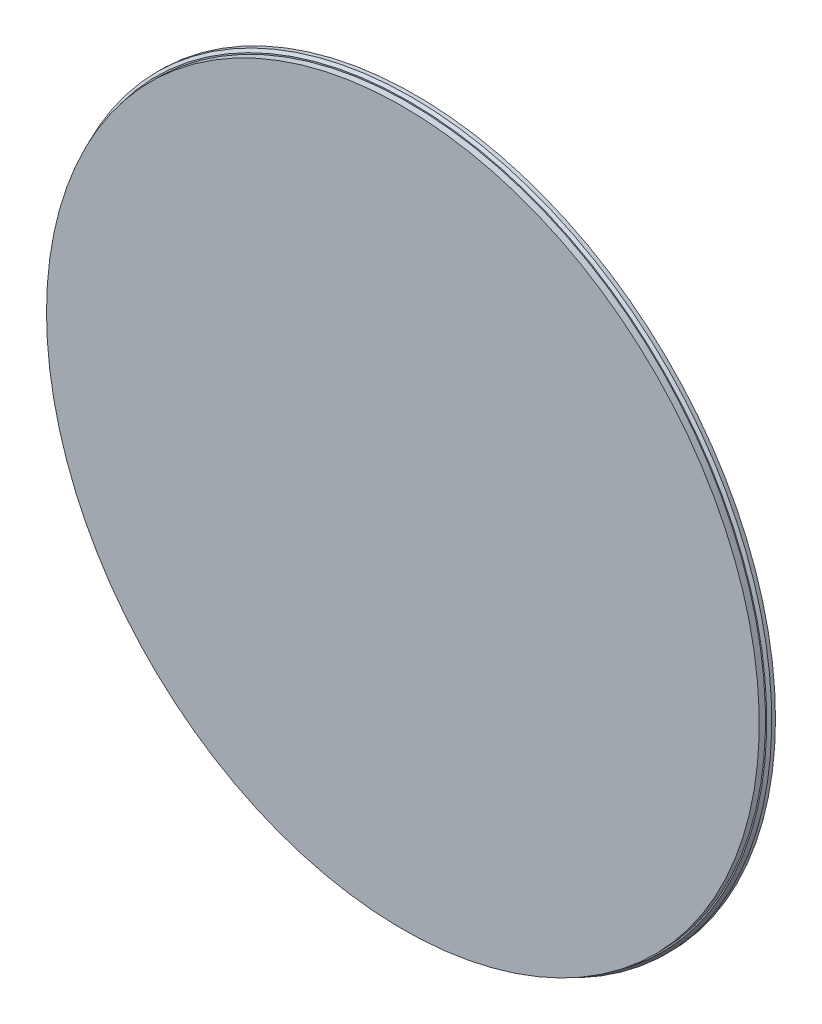
ISO-10303-21;
HEADER;
FILE_DESCRIPTION(('STEP AP214'),'2;1');
FILE_NAME('part.step','',(''),(''),'','','');
FILE_SCHEMA(('AUTOMOTIVE_DESIGN { 1 0 10303 214 1 1 1 1 }'));
ENDSEC;
DATA;
#1=APPLICATION_CONTEXT('core data for automotive mechanical design processes');
#2=APPLICATION_PROTOCOL_DEFINITION('international standard','automotive_design',2000,#1);
#3=PRODUCT_CONTEXT('',#1,'mechanical');
#4=PRODUCT('Part','Part','',(#3));
#5=PRODUCT_RELATED_PRODUCT_CATEGORY('part','',(#4));
#6=PRODUCT_DEFINITION_FORMATION('','',#4);
#7=PRODUCT_DEFINITION_CONTEXT('part definition',#1,'design');
#8=PRODUCT_DEFINITION('design','',#6,#7);
#9=PRODUCT_DEFINITION_SHAPE('','',#8);
#10=(LENGTH_UNIT() NAMED_UNIT(*) SI_UNIT(.MILLI.,.METRE.));
#11=(NAMED_UNIT(*) PLANE_ANGLE_UNIT() SI_UNIT($,.RADIAN.));
#12=(NAMED_UNIT(*) SI_UNIT($,.STERADIAN.) SOLID_ANGLE_UNIT());
#13=UNCERTAINTY_MEASURE_WITH_UNIT(LENGTH_MEASURE(1.E-05),#10,'distance_accuracy_value','');
#14=(GEOMETRIC_REPRESENTATION_CONTEXT(3) GLOBAL_UNCERTAINTY_ASSIGNED_CONTEXT((#13)) GLOBAL_UNIT_ASSIGNED_CONTEXT((#10,
#11,#12)) REPRESENTATION_CONTEXT('',''));
#15=CARTESIAN_POINT('',(0.,0.,0.));
#16=DIRECTION('',(0.,0.,1.));
#17=DIRECTION('',(1.,0.,0.));
#18=AXIS2_PLACEMENT_3D('',#15,#16,#17);
#19=CARTESIAN_POINT('',(0.,0.,10.));
#20=DIRECTION('',(0.,0.,1.));
#21=DIRECTION('',(1.,0.,0.));
#22=AXIS2_PLACEMENT_3D('',#19,#20,#21);
#23=PLANE('',#22);
#24=CARTESIAN_POINT('',(0.,0.,10.));
#25=DIRECTION('',(0.,0.,1.));
#26=DIRECTION('',(-1.,0.,0.));
#27=AXIS2_PLACEMENT_3D('',#24,#25,#26);
#28=CIRCLE('',#27,285.);
#29=CARTESIAN_POINT('',(-285.,0.,10.));
#30=VERTEX_POINT('',#29);
#31=EDGE_CURVE('E21',#30,#30,#28,.T.);
#32=ORIENTED_EDGE('',*,*,#31,.T.);
#33=EDGE_LOOP('',(#32));
#34=FACE_BOUND('',#33,.T.);
#35=ADVANCED_FACE('F17',(#34),#23,.T.);
#36=CARTESIAN_POINT('',(0.,0.,10.));
#37=DIRECTION('',(0.,0.,1.));
#38=DIRECTION('',(1.,0.,0.));
#39=AXIS2_PLACEMENT_3D('',#36,#37,#38);
#40=CYLINDRICAL_SURFACE('',#39,285.);
#41=ORIENTED_EDGE('',*,*,#31,.F.);
#42=DIRECTION('',(0.,0.,-1.));
#43=VECTOR('',#42,1.);
#44=CARTESIAN_POINT('',(-285.,0.,10.));
#45=LINE('',#44,#43);
#46=CARTESIAN_POINT('',(-285.,0.,5.));
#47=VERTEX_POINT('',#46);
#48=EDGE_CURVE('E11',#30,#47,#45,.T.);
#49=ORIENTED_EDGE('',*,*,#48,.T.);
#50=CARTESIAN_POINT('',(0.,0.,5.));
#51=DIRECTION('',(0.,0.,-1.));
#52=DIRECTION('',(1.,0.,0.));
#53=AXIS2_PLACEMENT_3D('',#50,#51,#52);
#54=CIRCLE('',#53,285.);
#55=EDGE_CURVE('E83',#47,#47,#54,.T.);
#56=ORIENTED_EDGE('',*,*,#55,.F.);
#57=ORIENTED_EDGE('',*,*,#48,.F.);
#58=EDGE_LOOP('',(#41,#49,#56,#57));
#59=FACE_BOUND('',#58,.T.);
#60=ADVANCED_FACE('F97',(#59),#40,.T.);
#61=CARTESIAN_POINT('',(0.,0.,5.));
#62=DIRECTION('',(0.,0.,1.));
#63=DIRECTION('',(1.,0.,0.));
#64=AXIS2_PLACEMENT_3D('',#61,#62,#63);
#65=PLANE('',#64);
#66=ORIENTED_EDGE('',*,*,#55,.T.);
#67=EDGE_LOOP('',(#66));
#68=FACE_BOUND('',#67,.T.);
#69=CARTESIAN_POINT('',(0.,0.,5.));
#70=DIRECTION('',(0.,0.,-1.));
#71=DIRECTION('',(-1.,0.,0.));
#72=AXIS2_PLACEMENT_3D('',#69,#70,#71);
#73=CIRCLE('',#72,286.);
#74=CARTESIAN_POINT('',(0.,286.000000000014,5.00000000001401));
#75=VERTEX_POINT('',#74);
#76=EDGE_CURVE('E86',#75,#75,#73,.T.);
#77=ORIENTED_EDGE('',*,*,#76,.F.);
#78=EDGE_LOOP('',(#77));
#79=FACE_BOUND('',#78,.T.);
#80=ADVANCED_FACE('F95',(#68,#79),#65,.T.);
#81=CARTESIAN_POINT('',(0.,0.,4.000000000528));
#82=DIRECTION('',(0.,0.,-1.));
#83=DIRECTION('',(0.,-1.,0.));
#84=AXIS2_PLACEMENT_3D('',#81,#82,#83);
#85=CONICAL_SURFACE('',#84,286.9999999995,0.785398163397448);
#86=CARTESIAN_POINT('',(0.,0.,3.));
#87=DIRECTION('',(0.,0.,-1.));
#88=DIRECTION('',(-1.,0.,0.));
#89=AXIS2_PLACEMENT_3D('',#86,#87,#88);
#90=CIRCLE('',#89,288.);
#91=CARTESIAN_POINT('',(-288.,0.,3.));
#92=VERTEX_POINT('',#91);
#93=CARTESIAN_POINT('',(0.,288.000000000014,3.000000000014));
#94=VERTEX_POINT('',#93);
#95=EDGE_CURVE('E63',#92,#94,#90,.T.);
#96=ORIENTED_EDGE('',*,*,#95,.F.);
#97=CARTESIAN_POINT('',(0.,0.,3.));
#98=DIRECTION('',(0.,0.,-1.));
#99=DIRECTION('',(-1.,0.,0.));
#100=AXIS2_PLACEMENT_3D('',#97,#98,#99);
#101=CIRCLE('',#100,288.);
#102=EDGE_CURVE('E68',#94,#92,#101,.T.);
#103=ORIENTED_EDGE('',*,*,#102,.F.);
#104=DIRECTION('',(0.,-0.707106781186548,0.707106781186548));
#105=VECTOR('',#104,1.);
#106=CARTESIAN_POINT('',(0.,286.9999999995,4.000000000528));
#107=LINE('',#106,#105);
#108=EDGE_CURVE('E67',#94,#75,#107,.T.);
#109=ORIENTED_EDGE('',*,*,#108,.T.);
#110=ORIENTED_EDGE('',*,*,#76,.T.);
#111=ORIENTED_EDGE('',*,*,#108,.F.);
#112=EDGE_LOOP('',(#96,#103,#109,#110,#111));
#113=FACE_BOUND('',#112,.T.);
#114=ADVANCED_FACE('F74',(#113),#85,.T.);
#115=CARTESIAN_POINT('',(0.,0.,0.));
#116=DIRECTION('',(0.,0.,1.));
#117=DIRECTION('',(1.,0.,0.));
#118=AXIS2_PLACEMENT_3D('',#115,#116,#117);
#119=CYLINDRICAL_SURFACE('',#118,288.);
#120=ORIENTED_EDGE('',*,*,#95,.T.);
#121=ORIENTED_EDGE('',*,*,#102,.T.);
#122=DIRECTION('',(0.,0.,-1.));
#123=VECTOR('',#122,1.);
#124=CARTESIAN_POINT('',(-288.,0.,0.));
#125=LINE('',#124,#123);
#126=CARTESIAN_POINT('',(-288.,0.,0.));
#127=VERTEX_POINT('',#126);
#128=EDGE_CURVE('E59',#92,#127,#125,.T.);
#129=ORIENTED_EDGE('',*,*,#128,.T.);
#130=CARTESIAN_POINT('',(0.,0.,0.));
#131=DIRECTION('',(0.,0.,1.));
#132=DIRECTION('',(1.,0.,0.));
#133=AXIS2_PLACEMENT_3D('',#130,#131,#132);
#134=CIRCLE('',#133,288.);
#135=EDGE_CURVE('E65',#127,#127,#134,.T.);
#136=ORIENTED_EDGE('',*,*,#135,.T.);
#137=ORIENTED_EDGE('',*,*,#128,.F.);
#138=EDGE_LOOP('',(#120,#121,#129,#136,#137));
#139=FACE_BOUND('',#138,.T.);
#140=ADVANCED_FACE('F61',(#139),#119,.T.);
#141=CARTESIAN_POINT('',(0.,0.,0.));
#142=DIRECTION('',(0.,0.,1.));
#143=DIRECTION('',(1.,0.,0.));
#144=AXIS2_PLACEMENT_3D('',#141,#142,#143);
#145=PLANE('',#144);
#146=ORIENTED_EDGE('',*,*,#135,.F.);
#147=EDGE_LOOP('',(#146));
#148=FACE_BOUND('',#147,.T.);
#149=ADVANCED_FACE('F19',(#148),#145,.F.);
#150=CLOSED_SHELL('',(#35,#60,#80,#114,#140,#149));
#151=MANIFOLD_SOLID_BREP('B1',#150);
#152=ADVANCED_BREP_SHAPE_REPRESENTATION('',(#18,#151),#14);
#153=SHAPE_DEFINITION_REPRESENTATION(#9,#152);
ENDSEC;
END-ISO-10303-21;
